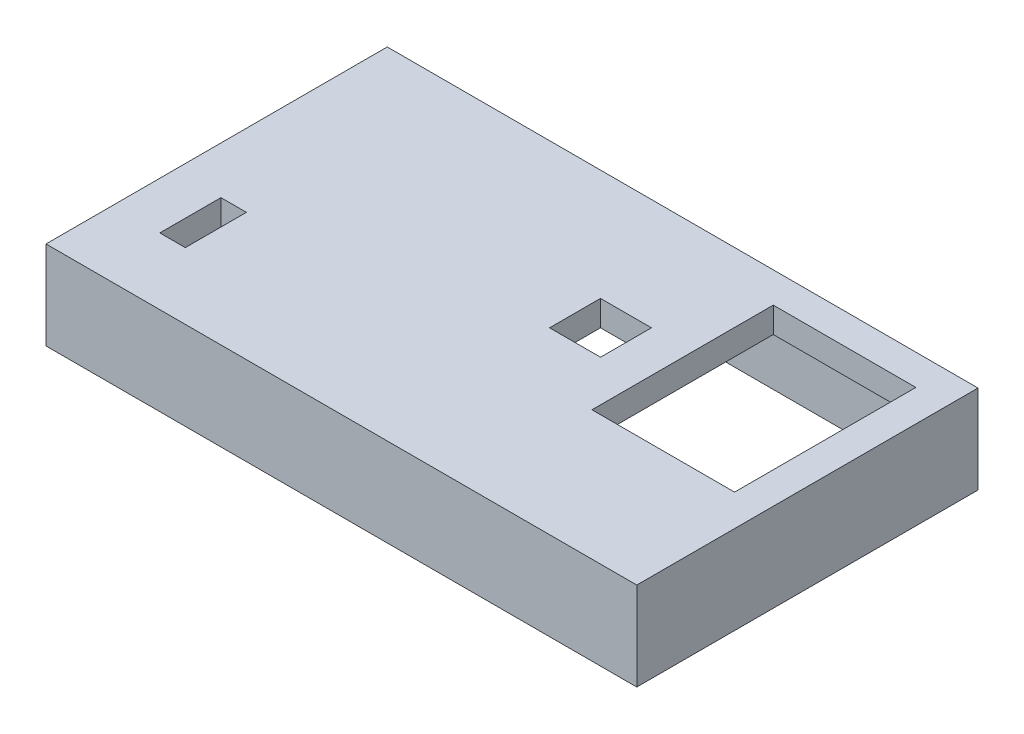
ISO-10303-21;
HEADER;
FILE_DESCRIPTION(('STEP AP214'),'2;1');
FILE_NAME('part.step','',(''),(''),'','','');
FILE_SCHEMA(('AUTOMOTIVE_DESIGN { 1 0 10303 214 1 1 1 1 }'));
ENDSEC;
DATA;
#1=APPLICATION_CONTEXT('core data for automotive mechanical design processes');
#2=APPLICATION_PROTOCOL_DEFINITION('international standard','automotive_design',2000,#1);
#3=PRODUCT_CONTEXT('',#1,'mechanical');
#4=PRODUCT('Part','Part','',(#3));
#5=PRODUCT_RELATED_PRODUCT_CATEGORY('part','',(#4));
#6=PRODUCT_DEFINITION_FORMATION('','',#4);
#7=PRODUCT_DEFINITION_CONTEXT('part definition',#1,'design');
#8=PRODUCT_DEFINITION('design','',#6,#7);
#9=PRODUCT_DEFINITION_SHAPE('','',#8);
#10=(LENGTH_UNIT() NAMED_UNIT(*) SI_UNIT(.MILLI.,.METRE.));
#11=(NAMED_UNIT(*) PLANE_ANGLE_UNIT() SI_UNIT($,.RADIAN.));
#12=(NAMED_UNIT(*) SI_UNIT($,.STERADIAN.) SOLID_ANGLE_UNIT());
#13=UNCERTAINTY_MEASURE_WITH_UNIT(LENGTH_MEASURE(1.E-05),#10,'distance_accuracy_value','');
#14=(GEOMETRIC_REPRESENTATION_CONTEXT(3) GLOBAL_UNCERTAINTY_ASSIGNED_CONTEXT((#13)) GLOBAL_UNIT_ASSIGNED_CONTEXT((#10,
#11,#12)) REPRESENTATION_CONTEXT('',''));
#15=CARTESIAN_POINT('',(0.,0.,0.));
#16=DIRECTION('',(0.,0.,1.));
#17=DIRECTION('',(1.,0.,0.));
#18=AXIS2_PLACEMENT_3D('',#15,#16,#17);
#19=CARTESIAN_POINT('',(0.,5.,0.));
#20=DIRECTION('',(1.,0.,0.));
#21=DIRECTION('',(0.,0.,-1.));
#22=AXIS2_PLACEMENT_3D('',#19,#20,#21);
#23=PLANE('',#22);
#24=DIRECTION('',(0.,-1.,0.));
#25=VECTOR('',#24,1.);
#26=CARTESIAN_POINT('',(0.,5.,-67.));
#27=LINE('',#26,#25);
#28=CARTESIAN_POINT('',(0.,5.,-67.));
#29=VERTEX_POINT('',#28);
#30=CARTESIAN_POINT('',(0.,-12.35,-67.));
#31=VERTEX_POINT('',#30);
#32=EDGE_CURVE('E381',#29,#31,#27,.T.);
#33=ORIENTED_EDGE('',*,*,#32,.T.);
#34=DIRECTION('',(0.,0.,-1.));
#35=VECTOR('',#34,1.);
#36=CARTESIAN_POINT('',(0.,-12.35,0.));
#37=LINE('',#36,#35);
#38=CARTESIAN_POINT('',(0.,-12.35,0.));
#39=VERTEX_POINT('',#38);
#40=EDGE_CURVE('E356',#39,#31,#37,.T.);
#41=ORIENTED_EDGE('',*,*,#40,.F.);
#42=DIRECTION('',(0.,-1.,0.));
#43=VECTOR('',#42,1.);
#44=CARTESIAN_POINT('',(0.,5.,0.));
#45=LINE('',#44,#43);
#46=CARTESIAN_POINT('',(0.,5.,0.));
#47=VERTEX_POINT('',#46);
#48=EDGE_CURVE('E11',#47,#39,#45,.T.);
#49=ORIENTED_EDGE('',*,*,#48,.F.);
#50=DIRECTION('',(0.,0.,1.));
#51=VECTOR('',#50,1.);
#52=CARTESIAN_POINT('',(0.,5.,0.));
#53=LINE('',#52,#51);
#54=EDGE_CURVE('E368',#29,#47,#53,.T.);
#55=ORIENTED_EDGE('',*,*,#54,.F.);
#56=EDGE_LOOP('',(#33,#41,#49,#55));
#57=FACE_BOUND('',#56,.T.);
#58=ADVANCED_FACE('F39',(#57),#23,.F.);
#59=CARTESIAN_POINT('',(0.,5.,0.));
#60=DIRECTION('',(0.,0.,-1.));
#61=DIRECTION('',(-1.,0.,0.));
#62=AXIS2_PLACEMENT_3D('',#59,#60,#61);
#63=PLANE('',#62);
#64=ORIENTED_EDGE('',*,*,#48,.T.);
#65=DIRECTION('',(-1.,0.,0.));
#66=VECTOR('',#65,1.);
#67=CARTESIAN_POINT('',(0.,-12.35,0.));
#68=LINE('',#67,#66);
#69=CARTESIAN_POINT('',(116.,-12.35,0.));
#70=VERTEX_POINT('',#69);
#71=EDGE_CURVE('E352',#70,#39,#68,.T.);
#72=ORIENTED_EDGE('',*,*,#71,.F.);
#73=DIRECTION('',(0.,-1.,0.));
#74=VECTOR('',#73,1.);
#75=CARTESIAN_POINT('',(116.,5.,0.));
#76=LINE('',#75,#74);
#77=CARTESIAN_POINT('',(116.,5.,0.));
#78=VERTEX_POINT('',#77);
#79=EDGE_CURVE('E47',#78,#70,#76,.T.);
#80=ORIENTED_EDGE('',*,*,#79,.F.);
#81=DIRECTION('',(1.,0.,0.));
#82=VECTOR('',#81,1.);
#83=CARTESIAN_POINT('',(0.,5.,0.));
#84=LINE('',#83,#82);
#85=EDGE_CURVE('E372',#47,#78,#84,.T.);
#86=ORIENTED_EDGE('',*,*,#85,.F.);
#87=EDGE_LOOP('',(#64,#72,#80,#86));
#88=FACE_BOUND('',#87,.T.);
#89=ADVANCED_FACE('F399',(#88),#63,.F.);
#90=CARTESIAN_POINT('',(116.,5.,0.));
#91=DIRECTION('',(-1.,0.,0.));
#92=DIRECTION('',(0.,0.,1.));
#93=AXIS2_PLACEMENT_3D('',#90,#91,#92);
#94=PLANE('',#93);
#95=ORIENTED_EDGE('',*,*,#79,.T.);
#96=DIRECTION('',(0.,0.,1.));
#97=VECTOR('',#96,1.);
#98=CARTESIAN_POINT('',(116.,-12.35,0.));
#99=LINE('',#98,#97);
#100=CARTESIAN_POINT('',(116.,-12.35,-67.));
#101=VERTEX_POINT('',#100);
#102=EDGE_CURVE('E364',#101,#70,#99,.T.);
#103=ORIENTED_EDGE('',*,*,#102,.F.);
#104=DIRECTION('',(0.,-1.,0.));
#105=VECTOR('',#104,1.);
#106=CARTESIAN_POINT('',(116.,5.,-67.));
#107=LINE('',#106,#105);
#108=CARTESIAN_POINT('',(116.,5.,-67.));
#109=VERTEX_POINT('',#108);
#110=EDGE_CURVE('E384',#109,#101,#107,.T.);
#111=ORIENTED_EDGE('',*,*,#110,.F.);
#112=DIRECTION('',(0.,0.,-1.));
#113=VECTOR('',#112,1.);
#114=CARTESIAN_POINT('',(116.,5.,0.));
#115=LINE('',#114,#113);
#116=EDGE_CURVE('E375',#78,#109,#115,.T.);
#117=ORIENTED_EDGE('',*,*,#116,.F.);
#118=EDGE_LOOP('',(#95,#103,#111,#117));
#119=FACE_BOUND('',#118,.T.);
#120=ADVANCED_FACE('F391',(#119),#94,.F.);
#121=CARTESIAN_POINT('',(0.,5.,-67.));
#122=DIRECTION('',(0.,0.,1.));
#123=DIRECTION('',(1.,0.,0.));
#124=AXIS2_PLACEMENT_3D('',#121,#122,#123);
#125=PLANE('',#124);
#126=ORIENTED_EDGE('',*,*,#110,.T.);
#127=DIRECTION('',(1.,0.,0.));
#128=VECTOR('',#127,1.);
#129=CARTESIAN_POINT('',(0.,-12.35,-67.));
#130=LINE('',#129,#128);
#131=EDGE_CURVE('E360',#31,#101,#130,.T.);
#132=ORIENTED_EDGE('',*,*,#131,.F.);
#133=ORIENTED_EDGE('',*,*,#32,.F.);
#134=DIRECTION('',(-1.,0.,0.));
#135=VECTOR('',#134,1.);
#136=CARTESIAN_POINT('',(0.,5.,-67.));
#137=LINE('',#136,#135);
#138=EDGE_CURVE('E378',#109,#29,#137,.T.);
#139=ORIENTED_EDGE('',*,*,#138,.F.);
#140=EDGE_LOOP('',(#126,#132,#133,#139));
#141=FACE_BOUND('',#140,.T.);
#142=ADVANCED_FACE('F406',(#141),#125,.F.);
#143=CARTESIAN_POINT('',(0.,5.,0.));
#144=DIRECTION('',(0.,-1.,0.));
#145=DIRECTION('',(0.,0.,-1.));
#146=AXIS2_PLACEMENT_3D('',#143,#144,#145);
#147=PLANE('',#146);
#148=DIRECTION('',(-1.,0.,0.));
#149=VECTOR('',#148,1.);
#150=CARTESIAN_POINT('',(9.29999999999997,5.,-13.05));
#151=LINE('',#150,#149);
#152=CARTESIAN_POINT('',(14.3,5.,-13.05));
#153=VERTEX_POINT('',#152);
#154=CARTESIAN_POINT('',(9.29999999999997,5.,-13.05));
#155=VERTEX_POINT('',#154);
#156=EDGE_CURVE('E184',#153,#155,#151,.T.);
#157=ORIENTED_EDGE('',*,*,#156,.T.);
#158=DIRECTION('',(0.,0.,-1.));
#159=VECTOR('',#158,1.);
#160=CARTESIAN_POINT('',(9.29999999999997,5.,-13.05));
#161=LINE('',#160,#159);
#162=CARTESIAN_POINT('',(9.29999999999997,5.,-25.05));
#163=VERTEX_POINT('',#162);
#164=EDGE_CURVE('E177',#155,#163,#161,.T.);
#165=ORIENTED_EDGE('',*,*,#164,.T.);
#166=DIRECTION('',(1.,0.,0.));
#167=VECTOR('',#166,1.);
#168=CARTESIAN_POINT('',(9.29999999999997,5.,-25.05));
#169=LINE('',#168,#167);
#170=CARTESIAN_POINT('',(14.3,5.,-25.05));
#171=VERTEX_POINT('',#170);
#172=EDGE_CURVE('E187',#163,#171,#169,.T.);
#173=ORIENTED_EDGE('',*,*,#172,.T.);
#174=DIRECTION('',(0.,0.,1.));
#175=VECTOR('',#174,1.);
#176=CARTESIAN_POINT('',(14.3,5.,-13.05));
#177=LINE('',#176,#175);
#178=EDGE_CURVE('E54',#171,#153,#177,.T.);
#179=ORIENTED_EDGE('',*,*,#178,.T.);
#180=EDGE_LOOP('',(#157,#165,#173,#179));
#181=FACE_BOUND('',#180,.T.);
#182=DIRECTION('',(-1.,0.,0.));
#183=VECTOR('',#182,1.);
#184=CARTESIAN_POINT('',(63.7,5.,-35.18));
#185=LINE('',#184,#183);
#186=CARTESIAN_POINT('',(73.7,5.,-35.18));
#187=VERTEX_POINT('',#186);
#188=CARTESIAN_POINT('',(63.7,5.,-35.18));
#189=VERTEX_POINT('',#188);
#190=EDGE_CURVE('E237',#187,#189,#185,.T.);
#191=ORIENTED_EDGE('',*,*,#190,.T.);
#192=DIRECTION('',(0.,0.,-1.));
#193=VECTOR('',#192,1.);
#194=CARTESIAN_POINT('',(63.7,5.,-35.18));
#195=LINE('',#194,#193);
#196=CARTESIAN_POINT('',(63.7,5.,-45.18));
#197=VERTEX_POINT('',#196);
#198=EDGE_CURVE('E224',#189,#197,#195,.T.);
#199=ORIENTED_EDGE('',*,*,#198,.T.);
#200=DIRECTION('',(1.,0.,0.));
#201=VECTOR('',#200,1.);
#202=CARTESIAN_POINT('',(63.7,5.,-45.18));
#203=LINE('',#202,#201);
#204=CARTESIAN_POINT('',(73.7,5.,-45.18));
#205=VERTEX_POINT('',#204);
#206=EDGE_CURVE('E228',#197,#205,#203,.T.);
#207=ORIENTED_EDGE('',*,*,#206,.T.);
#208=DIRECTION('',(0.,0.,1.));
#209=VECTOR('',#208,1.);
#210=CARTESIAN_POINT('',(73.7,5.,-35.18));
#211=LINE('',#210,#209);
#212=EDGE_CURVE('E233',#205,#187,#211,.T.);
#213=ORIENTED_EDGE('',*,*,#212,.T.);
#214=EDGE_LOOP('',(#191,#199,#207,#213));
#215=FACE_BOUND('',#214,.T.);
#216=DIRECTION('',(-1.,0.,0.));
#217=VECTOR('',#216,1.);
#218=CARTESIAN_POINT('',(81.8,5.,-25.4));
#219=LINE('',#218,#217);
#220=CARTESIAN_POINT('',(109.8,5.,-25.4));
#221=VERTEX_POINT('',#220);
#222=CARTESIAN_POINT('',(81.8,5.,-25.4));
#223=VERTEX_POINT('',#222);
#224=EDGE_CURVE('E281',#221,#223,#219,.T.);
#225=ORIENTED_EDGE('',*,*,#224,.T.);
#226=DIRECTION('',(0.,0.,-1.));
#227=VECTOR('',#226,1.);
#228=CARTESIAN_POINT('',(81.8,5.,-25.4));
#229=LINE('',#228,#227);
#230=CARTESIAN_POINT('',(81.8,5.,-61.));
#231=VERTEX_POINT('',#230);
#232=EDGE_CURVE('E268',#223,#231,#229,.T.);
#233=ORIENTED_EDGE('',*,*,#232,.T.);
#234=DIRECTION('',(1.,0.,0.));
#235=VECTOR('',#234,1.);
#236=CARTESIAN_POINT('',(81.8,5.,-61.));
#237=LINE('',#236,#235);
#238=CARTESIAN_POINT('',(109.8,5.,-61.));
#239=VERTEX_POINT('',#238);
#240=EDGE_CURVE('E272',#231,#239,#237,.T.);
#241=ORIENTED_EDGE('',*,*,#240,.T.);
#242=DIRECTION('',(0.,0.,1.));
#243=VECTOR('',#242,1.);
#244=CARTESIAN_POINT('',(109.8,5.,-25.4));
#245=LINE('',#244,#243);
#246=EDGE_CURVE('E277',#239,#221,#245,.T.);
#247=ORIENTED_EDGE('',*,*,#246,.T.);
#248=EDGE_LOOP('',(#225,#233,#241,#247));
#249=FACE_BOUND('',#248,.T.);
#250=ORIENTED_EDGE('',*,*,#54,.T.);
#251=ORIENTED_EDGE('',*,*,#85,.T.);
#252=ORIENTED_EDGE('',*,*,#116,.T.);
#253=ORIENTED_EDGE('',*,*,#138,.T.);
#254=EDGE_LOOP('',(#250,#251,#252,#253));
#255=FACE_BOUND('',#254,.T.);
#256=ADVANCED_FACE('F192',(#181,#215,#249,#255),#147,.F.);
#257=CARTESIAN_POINT('',(0.,-12.35,0.));
#258=DIRECTION('',(0.,1.,0.));
#259=DIRECTION('',(0.,0.,1.));
#260=AXIS2_PLACEMENT_3D('',#257,#258,#259);
#261=PLANE('',#260);
#262=ORIENTED_EDGE('',*,*,#71,.T.);
#263=ORIENTED_EDGE('',*,*,#40,.T.);
#264=ORIENTED_EDGE('',*,*,#131,.T.);
#265=ORIENTED_EDGE('',*,*,#102,.T.);
#266=EDGE_LOOP('',(#262,#263,#264,#265));
#267=FACE_BOUND('',#266,.T.);
#268=DIRECTION('',(0.,0.,-1.));
#269=VECTOR('',#268,1.);
#270=CARTESIAN_POINT('',(2.99999999999997,-12.35,-3.));
#271=LINE('',#270,#269);
#272=CARTESIAN_POINT('',(2.99999999999997,-12.35,-3.));
#273=VERTEX_POINT('',#272);
#274=CARTESIAN_POINT('',(2.99999999999998,-12.35,-64.));
#275=VERTEX_POINT('',#274);
#276=EDGE_CURVE('E312',#273,#275,#271,.T.);
#277=ORIENTED_EDGE('',*,*,#276,.F.);
#278=DIRECTION('',(-1.,0.,0.));
#279=VECTOR('',#278,1.);
#280=CARTESIAN_POINT('',(2.99999999999997,-12.35,-3.));
#281=LINE('',#280,#279);
#282=CARTESIAN_POINT('',(113.,-12.35,-3.));
#283=VERTEX_POINT('',#282);
#284=EDGE_CURVE('E323',#283,#273,#281,.T.);
#285=ORIENTED_EDGE('',*,*,#284,.F.);
#286=DIRECTION('',(0.,0.,1.));
#287=VECTOR('',#286,1.);
#288=CARTESIAN_POINT('',(113.,-12.35,-3.));
#289=LINE('',#288,#287);
#290=CARTESIAN_POINT('',(113.,-12.35,-64.));
#291=VERTEX_POINT('',#290);
#292=EDGE_CURVE('E319',#291,#283,#289,.T.);
#293=ORIENTED_EDGE('',*,*,#292,.F.);
#294=DIRECTION('',(1.,0.,0.));
#295=VECTOR('',#294,1.);
#296=CARTESIAN_POINT('',(2.99999999999998,-12.35,-64.));
#297=LINE('',#296,#295);
#298=EDGE_CURVE('E315',#275,#291,#297,.T.);
#299=ORIENTED_EDGE('',*,*,#298,.F.);
#300=EDGE_LOOP('',(#277,#285,#293,#299));
#301=FACE_BOUND('',#300,.T.);
#302=ADVANCED_FACE('F396',(#267,#301),#261,.F.);
#303=CARTESIAN_POINT('',(2.99999999999997,-12.35,-3.));
#304=DIRECTION('',(1.,0.,0.));
#305=DIRECTION('',(0.,0.,-1.));
#306=AXIS2_PLACEMENT_3D('',#303,#304,#305);
#307=PLANE('',#306);
#308=DIRECTION('',(0.,0.,-1.));
#309=VECTOR('',#308,1.);
#310=CARTESIAN_POINT('',(2.99999999999997,0.,-3.));
#311=LINE('',#310,#309);
#312=CARTESIAN_POINT('',(2.99999999999997,0.,-3.));
#313=VERTEX_POINT('',#312);
#314=CARTESIAN_POINT('',(2.99999999999998,0.,-64.));
#315=VERTEX_POINT('',#314);
#316=EDGE_CURVE('E302',#313,#315,#311,.T.);
#317=ORIENTED_EDGE('',*,*,#316,.F.);
#318=DIRECTION('',(0.,1.,0.));
#319=VECTOR('',#318,1.);
#320=CARTESIAN_POINT('',(2.99999999999997,-12.35,-3.));
#321=LINE('',#320,#319);
#322=EDGE_CURVE('E326',#273,#313,#321,.T.);
#323=ORIENTED_EDGE('',*,*,#322,.F.);
#324=ORIENTED_EDGE('',*,*,#276,.T.);
#325=DIRECTION('',(0.,1.,0.));
#326=VECTOR('',#325,1.);
#327=CARTESIAN_POINT('',(2.99999999999998,-12.35,-64.));
#328=LINE('',#327,#326);
#329=EDGE_CURVE('E348',#275,#315,#328,.T.);
#330=ORIENTED_EDGE('',*,*,#329,.T.);
#331=EDGE_LOOP('',(#317,#323,#324,#330));
#332=FACE_BOUND('',#331,.T.);
#333=ADVANCED_FACE('F415',(#332),#307,.T.);
#334=CARTESIAN_POINT('',(2.99999999999998,-12.35,-64.));
#335=DIRECTION('',(0.,0.,1.));
#336=DIRECTION('',(1.,0.,0.));
#337=AXIS2_PLACEMENT_3D('',#334,#335,#336);
#338=PLANE('',#337);
#339=DIRECTION('',(1.,0.,0.));
#340=VECTOR('',#339,1.);
#341=CARTESIAN_POINT('',(2.99999999999998,0.,-64.));
#342=LINE('',#341,#340);
#343=CARTESIAN_POINT('',(113.,0.,-64.));
#344=VERTEX_POINT('',#343);
#345=EDGE_CURVE('E329',#315,#344,#342,.T.);
#346=ORIENTED_EDGE('',*,*,#345,.F.);
#347=ORIENTED_EDGE('',*,*,#329,.F.);
#348=ORIENTED_EDGE('',*,*,#298,.T.);
#349=DIRECTION('',(0.,1.,0.));
#350=VECTOR('',#349,1.);
#351=CARTESIAN_POINT('',(113.,-12.35,-64.));
#352=LINE('',#351,#350);
#353=EDGE_CURVE('E344',#291,#344,#352,.T.);
#354=ORIENTED_EDGE('',*,*,#353,.T.);
#355=EDGE_LOOP('',(#346,#347,#348,#354));
#356=FACE_BOUND('',#355,.T.);
#357=ADVANCED_FACE('F459',(#356),#338,.T.);
#358=CARTESIAN_POINT('',(113.,-12.35,-3.));
#359=DIRECTION('',(-1.,0.,0.));
#360=DIRECTION('',(0.,0.,1.));
#361=AXIS2_PLACEMENT_3D('',#358,#359,#360);
#362=PLANE('',#361);
#363=DIRECTION('',(0.,0.,1.));
#364=VECTOR('',#363,1.);
#365=CARTESIAN_POINT('',(113.,0.,-3.));
#366=LINE('',#365,#364);
#367=CARTESIAN_POINT('',(113.,0.,-3.));
#368=VERTEX_POINT('',#367);
#369=EDGE_CURVE('E332',#344,#368,#366,.T.);
#370=ORIENTED_EDGE('',*,*,#369,.F.);
#371=ORIENTED_EDGE('',*,*,#353,.F.);
#372=ORIENTED_EDGE('',*,*,#292,.T.);
#373=DIRECTION('',(0.,1.,0.));
#374=VECTOR('',#373,1.);
#375=CARTESIAN_POINT('',(113.,-12.35,-3.));
#376=LINE('',#375,#374);
#377=EDGE_CURVE('E340',#283,#368,#376,.T.);
#378=ORIENTED_EDGE('',*,*,#377,.T.);
#379=EDGE_LOOP('',(#370,#371,#372,#378));
#380=FACE_BOUND('',#379,.T.);
#381=ADVANCED_FACE('F439',(#380),#362,.T.);
#382=CARTESIAN_POINT('',(2.99999999999997,-12.35,-3.));
#383=DIRECTION('',(0.,0.,-1.));
#384=DIRECTION('',(-1.,0.,0.));
#385=AXIS2_PLACEMENT_3D('',#382,#383,#384);
#386=PLANE('',#385);
#387=DIRECTION('',(-1.,0.,0.));
#388=VECTOR('',#387,1.);
#389=CARTESIAN_POINT('',(2.99999999999997,0.,-3.));
#390=LINE('',#389,#388);
#391=EDGE_CURVE('E316',#368,#313,#390,.T.);
#392=ORIENTED_EDGE('',*,*,#391,.F.);
#393=ORIENTED_EDGE('',*,*,#377,.F.);
#394=ORIENTED_EDGE('',*,*,#284,.T.);
#395=ORIENTED_EDGE('',*,*,#322,.T.);
#396=EDGE_LOOP('',(#392,#393,#394,#395));
#397=FACE_BOUND('',#396,.T.);
#398=ADVANCED_FACE('F430',(#397),#386,.T.);
#399=CARTESIAN_POINT('',(0.,0.,0.));
#400=DIRECTION('',(0.,-1.,0.));
#401=DIRECTION('',(0.,0.,-1.));
#402=AXIS2_PLACEMENT_3D('',#399,#400,#401);
#403=PLANE('',#402);
#404=DIRECTION('',(0.,0.,-1.));
#405=VECTOR('',#404,1.);
#406=CARTESIAN_POINT('',(9.29999999999997,0.,-13.05));
#407=LINE('',#406,#405);
#408=CARTESIAN_POINT('',(9.29999999999997,0.,-13.05));
#409=VERTEX_POINT('',#408);
#410=CARTESIAN_POINT('',(9.29999999999997,0.,-25.05));
#411=VERTEX_POINT('',#410);
#412=EDGE_CURVE('E62',#409,#411,#407,.T.);
#413=ORIENTED_EDGE('',*,*,#412,.F.);
#414=DIRECTION('',(-1.,0.,0.));
#415=VECTOR('',#414,1.);
#416=CARTESIAN_POINT('',(9.29999999999997,0.,-13.05));
#417=LINE('',#416,#415);
#418=CARTESIAN_POINT('',(14.3,0.,-13.05));
#419=VERTEX_POINT('',#418);
#420=EDGE_CURVE('E196',#419,#409,#417,.T.);
#421=ORIENTED_EDGE('',*,*,#420,.F.);
#422=DIRECTION('',(0.,0.,1.));
#423=VECTOR('',#422,1.);
#424=CARTESIAN_POINT('',(14.3,0.,-13.05));
#425=LINE('',#424,#423);
#426=CARTESIAN_POINT('',(14.3,0.,-25.05));
#427=VERTEX_POINT('',#426);
#428=EDGE_CURVE('E200',#427,#419,#425,.T.);
#429=ORIENTED_EDGE('',*,*,#428,.F.);
#430=DIRECTION('',(1.,0.,0.));
#431=VECTOR('',#430,1.);
#432=CARTESIAN_POINT('',(9.29999999999997,0.,-25.05));
#433=LINE('',#432,#431);
#434=EDGE_CURVE('E209',#411,#427,#433,.T.);
#435=ORIENTED_EDGE('',*,*,#434,.F.);
#436=EDGE_LOOP('',(#413,#421,#429,#435));
#437=FACE_BOUND('',#436,.T.);
#438=DIRECTION('',(0.,0.,-1.));
#439=VECTOR('',#438,1.);
#440=CARTESIAN_POINT('',(63.7,0.,-35.18));
#441=LINE('',#440,#439);
#442=CARTESIAN_POINT('',(63.7,0.,-35.18));
#443=VERTEX_POINT('',#442);
#444=CARTESIAN_POINT('',(63.7,0.,-45.18));
#445=VERTEX_POINT('',#444);
#446=EDGE_CURVE('E218',#443,#445,#441,.T.);
#447=ORIENTED_EDGE('',*,*,#446,.F.);
#448=DIRECTION('',(-1.,0.,0.));
#449=VECTOR('',#448,1.);
#450=CARTESIAN_POINT('',(63.7,0.,-35.18));
#451=LINE('',#450,#449);
#452=CARTESIAN_POINT('',(73.7,0.,-35.18));
#453=VERTEX_POINT('',#452);
#454=EDGE_CURVE('E229',#453,#443,#451,.T.);
#455=ORIENTED_EDGE('',*,*,#454,.F.);
#456=DIRECTION('',(0.,0.,1.));
#457=VECTOR('',#456,1.);
#458=CARTESIAN_POINT('',(73.7,0.,-35.18));
#459=LINE('',#458,#457);
#460=CARTESIAN_POINT('',(73.7,0.,-45.18));
#461=VERTEX_POINT('',#460);
#462=EDGE_CURVE('E248',#461,#453,#459,.T.);
#463=ORIENTED_EDGE('',*,*,#462,.F.);
#464=DIRECTION('',(1.,0.,0.));
#465=VECTOR('',#464,1.);
#466=CARTESIAN_POINT('',(63.7,0.,-45.18));
#467=LINE('',#466,#465);
#468=EDGE_CURVE('E244',#445,#461,#467,.T.);
#469=ORIENTED_EDGE('',*,*,#468,.F.);
#470=EDGE_LOOP('',(#447,#455,#463,#469));
#471=FACE_BOUND('',#470,.T.);
#472=DIRECTION('',(0.,0.,-1.));
#473=VECTOR('',#472,1.);
#474=CARTESIAN_POINT('',(81.8,0.,-25.4));
#475=LINE('',#474,#473);
#476=CARTESIAN_POINT('',(81.8,0.,-25.4));
#477=VERTEX_POINT('',#476);
#478=CARTESIAN_POINT('',(81.8,0.,-61.));
#479=VERTEX_POINT('',#478);
#480=EDGE_CURVE('E258',#477,#479,#475,.T.);
#481=ORIENTED_EDGE('',*,*,#480,.F.);
#482=DIRECTION('',(-1.,0.,0.));
#483=VECTOR('',#482,1.);
#484=CARTESIAN_POINT('',(81.8,0.,-25.4));
#485=LINE('',#484,#483);
#486=CARTESIAN_POINT('',(109.8,0.,-25.4));
#487=VERTEX_POINT('',#486);
#488=EDGE_CURVE('E273',#487,#477,#485,.T.);
#489=ORIENTED_EDGE('',*,*,#488,.F.);
#490=DIRECTION('',(0.,0.,1.));
#491=VECTOR('',#490,1.);
#492=CARTESIAN_POINT('',(109.8,0.,-25.4));
#493=LINE('',#492,#491);
#494=CARTESIAN_POINT('',(109.8,0.,-61.));
#495=VERTEX_POINT('',#494);
#496=EDGE_CURVE('E292',#495,#487,#493,.T.);
#497=ORIENTED_EDGE('',*,*,#496,.F.);
#498=DIRECTION('',(1.,0.,0.));
#499=VECTOR('',#498,1.);
#500=CARTESIAN_POINT('',(81.8,0.,-61.));
#501=LINE('',#500,#499);
#502=EDGE_CURVE('E288',#479,#495,#501,.T.);
#503=ORIENTED_EDGE('',*,*,#502,.F.);
#504=EDGE_LOOP('',(#481,#489,#497,#503));
#505=FACE_BOUND('',#504,.T.);
#506=ORIENTED_EDGE('',*,*,#316,.T.);
#507=ORIENTED_EDGE('',*,*,#345,.T.);
#508=ORIENTED_EDGE('',*,*,#369,.T.);
#509=ORIENTED_EDGE('',*,*,#391,.T.);
#510=EDGE_LOOP('',(#506,#507,#508,#509));
#511=FACE_BOUND('',#510,.T.);
#512=ADVANCED_FACE('F427',(#437,#471,#505,#511),#403,.T.);
#513=CARTESIAN_POINT('',(81.8,5.,-25.4));
#514=DIRECTION('',(-1.,0.,0.));
#515=DIRECTION('',(0.,0.,1.));
#516=AXIS2_PLACEMENT_3D('',#513,#514,#515);
#517=PLANE('',#516);
#518=ORIENTED_EDGE('',*,*,#480,.T.);
#519=DIRECTION('',(0.,-1.,0.));
#520=VECTOR('',#519,1.);
#521=CARTESIAN_POINT('',(81.8,5.,-61.));
#522=LINE('',#521,#520);
#523=EDGE_CURVE('E285',#231,#479,#522,.T.);
#524=ORIENTED_EDGE('',*,*,#523,.F.);
#525=ORIENTED_EDGE('',*,*,#232,.F.);
#526=DIRECTION('',(0.,-1.,0.));
#527=VECTOR('',#526,1.);
#528=CARTESIAN_POINT('',(81.8,5.,-25.4));
#529=LINE('',#528,#527);
#530=EDGE_CURVE('E299',#223,#477,#529,.T.);
#531=ORIENTED_EDGE('',*,*,#530,.T.);
#532=EDGE_LOOP('',(#518,#524,#525,#531));
#533=FACE_BOUND('',#532,.T.);
#534=ADVANCED_FACE('F429',(#533),#517,.F.);
#535=CARTESIAN_POINT('',(81.8,5.,-25.4));
#536=DIRECTION('',(0.,0.,1.));
#537=DIRECTION('',(1.,0.,0.));
#538=AXIS2_PLACEMENT_3D('',#535,#536,#537);
#539=PLANE('',#538);
#540=ORIENTED_EDGE('',*,*,#488,.T.);
#541=ORIENTED_EDGE('',*,*,#530,.F.);
#542=ORIENTED_EDGE('',*,*,#224,.F.);
#543=DIRECTION('',(0.,-1.,0.));
#544=VECTOR('',#543,1.);
#545=CARTESIAN_POINT('',(109.8,5.,-25.4));
#546=LINE('',#545,#544);
#547=EDGE_CURVE('E303',#221,#487,#546,.T.);
#548=ORIENTED_EDGE('',*,*,#547,.T.);
#549=EDGE_LOOP('',(#540,#541,#542,#548));
#550=FACE_BOUND('',#549,.T.);
#551=ADVANCED_FACE('F436',(#550),#539,.F.);
#552=CARTESIAN_POINT('',(109.8,5.,-25.4));
#553=DIRECTION('',(1.,0.,0.));
#554=DIRECTION('',(0.,0.,-1.));
#555=AXIS2_PLACEMENT_3D('',#552,#553,#554);
#556=PLANE('',#555);
#557=ORIENTED_EDGE('',*,*,#496,.T.);
#558=ORIENTED_EDGE('',*,*,#547,.F.);
#559=ORIENTED_EDGE('',*,*,#246,.F.);
#560=DIRECTION('',(0.,-1.,0.));
#561=VECTOR('',#560,1.);
#562=CARTESIAN_POINT('',(109.8,5.,-61.));
#563=LINE('',#562,#561);
#564=EDGE_CURVE('E306',#239,#495,#563,.T.);
#565=ORIENTED_EDGE('',*,*,#564,.T.);
#566=EDGE_LOOP('',(#557,#558,#559,#565));
#567=FACE_BOUND('',#566,.T.);
#568=ADVANCED_FACE('F508',(#567),#556,.F.);
#569=CARTESIAN_POINT('',(81.8,5.,-61.));
#570=DIRECTION('',(0.,0.,-1.));
#571=DIRECTION('',(-1.,0.,0.));
#572=AXIS2_PLACEMENT_3D('',#569,#570,#571);
#573=PLANE('',#572);
#574=ORIENTED_EDGE('',*,*,#502,.T.);
#575=ORIENTED_EDGE('',*,*,#564,.F.);
#576=ORIENTED_EDGE('',*,*,#240,.F.);
#577=ORIENTED_EDGE('',*,*,#523,.T.);
#578=EDGE_LOOP('',(#574,#575,#576,#577));
#579=FACE_BOUND('',#578,.T.);
#580=ADVANCED_FACE('F518',(#579),#573,.F.);
#581=CARTESIAN_POINT('',(63.7,5.,-35.18));
#582=DIRECTION('',(-1.,0.,0.));
#583=DIRECTION('',(0.,0.,1.));
#584=AXIS2_PLACEMENT_3D('',#581,#582,#583);
#585=PLANE('',#584);
#586=ORIENTED_EDGE('',*,*,#446,.T.);
#587=DIRECTION('',(0.,-1.,0.));
#588=VECTOR('',#587,1.);
#589=CARTESIAN_POINT('',(63.7,5.,-45.18));
#590=LINE('',#589,#588);
#591=EDGE_CURVE('E241',#197,#445,#590,.T.);
#592=ORIENTED_EDGE('',*,*,#591,.F.);
#593=ORIENTED_EDGE('',*,*,#198,.F.);
#594=DIRECTION('',(0.,-1.,0.));
#595=VECTOR('',#594,1.);
#596=CARTESIAN_POINT('',(63.7,5.,-35.18));
#597=LINE('',#596,#595);
#598=EDGE_CURVE('E255',#189,#443,#597,.T.);
#599=ORIENTED_EDGE('',*,*,#598,.T.);
#600=EDGE_LOOP('',(#586,#592,#593,#599));
#601=FACE_BOUND('',#600,.T.);
#602=ADVANCED_FACE('F528',(#601),#585,.F.);
#603=CARTESIAN_POINT('',(63.7,5.,-35.18));
#604=DIRECTION('',(0.,0.,1.));
#605=DIRECTION('',(1.,0.,0.));
#606=AXIS2_PLACEMENT_3D('',#603,#604,#605);
#607=PLANE('',#606);
#608=ORIENTED_EDGE('',*,*,#454,.T.);
#609=ORIENTED_EDGE('',*,*,#598,.F.);
#610=ORIENTED_EDGE('',*,*,#190,.F.);
#611=DIRECTION('',(0.,-1.,0.));
#612=VECTOR('',#611,1.);
#613=CARTESIAN_POINT('',(73.7,5.,-35.18));
#614=LINE('',#613,#612);
#615=EDGE_CURVE('E259',#187,#453,#614,.T.);
#616=ORIENTED_EDGE('',*,*,#615,.T.);
#617=EDGE_LOOP('',(#608,#609,#610,#616));
#618=FACE_BOUND('',#617,.T.);
#619=ADVANCED_FACE('F538',(#618),#607,.F.);
#620=CARTESIAN_POINT('',(73.7,5.,-35.18));
#621=DIRECTION('',(1.,0.,0.));
#622=DIRECTION('',(0.,0.,-1.));
#623=AXIS2_PLACEMENT_3D('',#620,#621,#622);
#624=PLANE('',#623);
#625=ORIENTED_EDGE('',*,*,#462,.T.);
#626=ORIENTED_EDGE('',*,*,#615,.F.);
#627=ORIENTED_EDGE('',*,*,#212,.F.);
#628=DIRECTION('',(0.,-1.,0.));
#629=VECTOR('',#628,1.);
#630=CARTESIAN_POINT('',(73.7,5.,-45.18));
#631=LINE('',#630,#629);
#632=EDGE_CURVE('E262',#205,#461,#631,.T.);
#633=ORIENTED_EDGE('',*,*,#632,.T.);
#634=EDGE_LOOP('',(#625,#626,#627,#633));
#635=FACE_BOUND('',#634,.T.);
#636=ADVANCED_FACE('F548',(#635),#624,.F.);
#637=CARTESIAN_POINT('',(63.7,5.,-45.18));
#638=DIRECTION('',(0.,0.,-1.));
#639=DIRECTION('',(-1.,0.,0.));
#640=AXIS2_PLACEMENT_3D('',#637,#638,#639);
#641=PLANE('',#640);
#642=ORIENTED_EDGE('',*,*,#468,.T.);
#643=ORIENTED_EDGE('',*,*,#632,.F.);
#644=ORIENTED_EDGE('',*,*,#206,.F.);
#645=ORIENTED_EDGE('',*,*,#591,.T.);
#646=EDGE_LOOP('',(#642,#643,#644,#645));
#647=FACE_BOUND('',#646,.T.);
#648=ADVANCED_FACE('F558',(#647),#641,.F.);
#649=CARTESIAN_POINT('',(9.29999999999997,5.,-13.05));
#650=DIRECTION('',(-1.,0.,0.));
#651=DIRECTION('',(0.,0.,1.));
#652=AXIS2_PLACEMENT_3D('',#649,#650,#651);
#653=PLANE('',#652);
#654=ORIENTED_EDGE('',*,*,#412,.T.);
#655=DIRECTION('',(0.,-1.,0.));
#656=VECTOR('',#655,1.);
#657=CARTESIAN_POINT('',(9.29999999999997,5.,-25.05));
#658=LINE('',#657,#656);
#659=EDGE_CURVE('E173',#163,#411,#658,.T.);
#660=ORIENTED_EDGE('',*,*,#659,.F.);
#661=ORIENTED_EDGE('',*,*,#164,.F.);
#662=DIRECTION('',(0.,-1.,0.));
#663=VECTOR('',#662,1.);
#664=CARTESIAN_POINT('',(9.29999999999997,5.,-13.05));
#665=LINE('',#664,#663);
#666=EDGE_CURVE('E215',#155,#409,#665,.T.);
#667=ORIENTED_EDGE('',*,*,#666,.T.);
#668=EDGE_LOOP('',(#654,#660,#661,#667));
#669=FACE_BOUND('',#668,.T.);
#670=ADVANCED_FACE('F175',(#669),#653,.F.);
#671=CARTESIAN_POINT('',(9.29999999999997,5.,-13.05));
#672=DIRECTION('',(0.,0.,1.));
#673=DIRECTION('',(1.,0.,0.));
#674=AXIS2_PLACEMENT_3D('',#671,#672,#673);
#675=PLANE('',#674);
#676=ORIENTED_EDGE('',*,*,#420,.T.);
#677=ORIENTED_EDGE('',*,*,#666,.F.);
#678=ORIENTED_EDGE('',*,*,#156,.F.);
#679=DIRECTION('',(0.,-1.,0.));
#680=VECTOR('',#679,1.);
#681=CARTESIAN_POINT('',(14.3,5.,-13.05));
#682=LINE('',#681,#680);
#683=EDGE_CURVE('E219',#153,#419,#682,.T.);
#684=ORIENTED_EDGE('',*,*,#683,.T.);
#685=EDGE_LOOP('',(#676,#677,#678,#684));
#686=FACE_BOUND('',#685,.T.);
#687=ADVANCED_FACE('F587',(#686),#675,.F.);
#688=CARTESIAN_POINT('',(14.3,5.,-13.05));
#689=DIRECTION('',(1.,0.,0.));
#690=DIRECTION('',(0.,0.,-1.));
#691=AXIS2_PLACEMENT_3D('',#688,#689,#690);
#692=PLANE('',#691);
#693=ORIENTED_EDGE('',*,*,#428,.T.);
#694=ORIENTED_EDGE('',*,*,#683,.F.);
#695=ORIENTED_EDGE('',*,*,#178,.F.);
#696=DIRECTION('',(0.,-1.,0.));
#697=VECTOR('',#696,1.);
#698=CARTESIAN_POINT('',(14.3,5.,-25.05));
#699=LINE('',#698,#697);
#700=EDGE_CURVE('E183',#171,#427,#699,.T.);
#701=ORIENTED_EDGE('',*,*,#700,.T.);
#702=EDGE_LOOP('',(#693,#694,#695,#701));
#703=FACE_BOUND('',#702,.T.);
#704=ADVANCED_FACE('F596',(#703),#692,.F.);
#705=CARTESIAN_POINT('',(9.29999999999997,5.,-25.05));
#706=DIRECTION('',(0.,0.,-1.));
#707=DIRECTION('',(-1.,0.,0.));
#708=AXIS2_PLACEMENT_3D('',#705,#706,#707);
#709=PLANE('',#708);
#710=ORIENTED_EDGE('',*,*,#434,.T.);
#711=ORIENTED_EDGE('',*,*,#700,.F.);
#712=ORIENTED_EDGE('',*,*,#172,.F.);
#713=ORIENTED_EDGE('',*,*,#659,.T.);
#714=EDGE_LOOP('',(#710,#711,#712,#713));
#715=FACE_BOUND('',#714,.T.);
#716=ADVANCED_FACE('F188',(#715),#709,.F.);
#717=CLOSED_SHELL('',(#58,#89,#120,#142,#256,#302,#333,#357,#381,#398,#512,#534,#551,#568,#580,
#602,#619,#636,#648,#670,#687,#704,#716));
#718=MANIFOLD_SOLID_BREP('B2',#717);
#719=ADVANCED_BREP_SHAPE_REPRESENTATION('',(#18,#718),#14);
#720=SHAPE_DEFINITION_REPRESENTATION(#9,#719);
ENDSEC;
END-ISO-10303-21;
